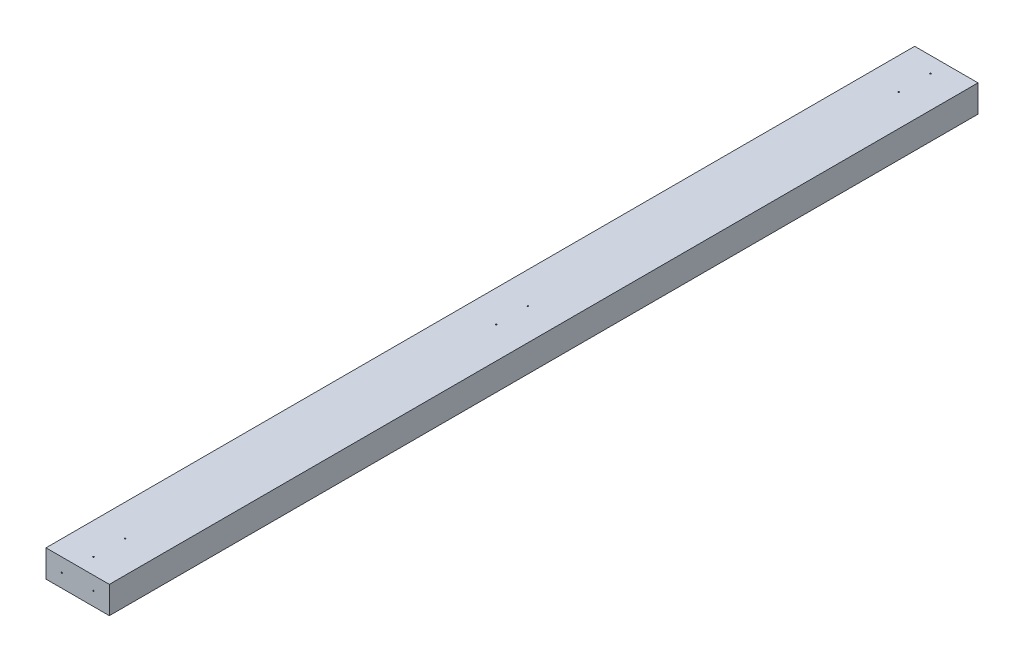
ISO-10303-21;
HEADER;
FILE_DESCRIPTION(('STEP AP214'),'2;1');
FILE_NAME('part.step','',(''),(''),'','','');
FILE_SCHEMA(('AUTOMOTIVE_DESIGN { 1 0 10303 214 1 1 1 1 }'));
ENDSEC;
DATA;
#1=APPLICATION_CONTEXT('core data for automotive mechanical design processes');
#2=APPLICATION_PROTOCOL_DEFINITION('international standard','automotive_design',2000,#1);
#3=PRODUCT_CONTEXT('',#1,'mechanical');
#4=PRODUCT('Part','Part','',(#3));
#5=PRODUCT_RELATED_PRODUCT_CATEGORY('part','',(#4));
#6=PRODUCT_DEFINITION_FORMATION('','',#4);
#7=PRODUCT_DEFINITION_CONTEXT('part definition',#1,'design');
#8=PRODUCT_DEFINITION('design','',#6,#7);
#9=PRODUCT_DEFINITION_SHAPE('','',#8);
#10=(LENGTH_UNIT() NAMED_UNIT(*) SI_UNIT(.MILLI.,.METRE.));
#11=(NAMED_UNIT(*) PLANE_ANGLE_UNIT() SI_UNIT($,.RADIAN.));
#12=(NAMED_UNIT(*) SI_UNIT($,.STERADIAN.) SOLID_ANGLE_UNIT());
#13=UNCERTAINTY_MEASURE_WITH_UNIT(LENGTH_MEASURE(1.E-05),#10,'distance_accuracy_value','');
#14=(GEOMETRIC_REPRESENTATION_CONTEXT(3) GLOBAL_UNCERTAINTY_ASSIGNED_CONTEXT((#13)) GLOBAL_UNIT_ASSIGNED_CONTEXT((#10,
#11,#12)) REPRESENTATION_CONTEXT('',''));
#15=CARTESIAN_POINT('',(0.,0.,0.));
#16=DIRECTION('',(0.,0.,1.));
#17=DIRECTION('',(1.,0.,0.));
#18=AXIS2_PLACEMENT_3D('',#15,#16,#17);
#19=CARTESIAN_POINT('',(0.,0.,1219.2));
#20=DIRECTION('',(1.,0.,0.));
#21=DIRECTION('',(0.,0.,-1.));
#22=AXIS2_PLACEMENT_3D('',#19,#20,#21);
#23=PLANE('',#22);
#24=DIRECTION('',(0.,-1.,0.));
#25=VECTOR('',#24,1.);
#26=CARTESIAN_POINT('',(0.,0.,0.));
#27=LINE('',#26,#25);
#28=CARTESIAN_POINT('',(0.,38.1,0.));
#29=VERTEX_POINT('',#28);
#30=CARTESIAN_POINT('',(0.,0.,0.));
#31=VERTEX_POINT('',#30);
#32=EDGE_CURVE('E95',#29,#31,#27,.T.);
#33=ORIENTED_EDGE('',*,*,#32,.T.);
#34=DIRECTION('',(0.,0.,-1.));
#35=VECTOR('',#34,1.);
#36=CARTESIAN_POINT('',(0.,0.,1219.2));
#37=LINE('',#36,#35);
#38=CARTESIAN_POINT('',(0.,0.,1219.2));
#39=VERTEX_POINT('',#38);
#40=EDGE_CURVE('E11',#39,#31,#37,.T.);
#41=ORIENTED_EDGE('',*,*,#40,.F.);
#42=DIRECTION('',(0.,-1.,0.));
#43=VECTOR('',#42,1.);
#44=CARTESIAN_POINT('',(0.,0.,1219.2));
#45=LINE('',#44,#43);
#46=CARTESIAN_POINT('',(0.,38.1,1219.2));
#47=VERTEX_POINT('',#46);
#48=EDGE_CURVE('E83',#47,#39,#45,.T.);
#49=ORIENTED_EDGE('',*,*,#48,.F.);
#50=DIRECTION('',(0.,0.,-1.));
#51=VECTOR('',#50,1.);
#52=CARTESIAN_POINT('',(0.,38.1,1219.2));
#53=LINE('',#52,#51);
#54=EDGE_CURVE('E91',#47,#29,#53,.T.);
#55=ORIENTED_EDGE('',*,*,#54,.T.);
#56=EDGE_LOOP('',(#33,#41,#49,#55));
#57=FACE_BOUND('',#56,.T.);
#58=ADVANCED_FACE('F32',(#57),#23,.F.);
#59=CARTESIAN_POINT('',(0.,0.,1219.2));
#60=DIRECTION('',(0.,1.,0.));
#61=DIRECTION('',(0.,0.,1.));
#62=AXIS2_PLACEMENT_3D('',#59,#60,#61);
#63=PLANE('',#62);
#64=CARTESIAN_POINT('',(44.4499999999982,0.,631.825000000001));
#65=DIRECTION('',(0.,-1.,0.));
#66=DIRECTION('',(0.,0.,-1.));
#67=AXIS2_PLACEMENT_3D('',#64,#65,#66);
#68=CIRCLE('',#67,0.876300000000114);
#69=CARTESIAN_POINT('',(44.4499999999982,0.,630.948700000001));
#70=VERTEX_POINT('',#69);
#71=EDGE_CURVE('E153',#70,#70,#68,.T.);
#72=ORIENTED_EDGE('',*,*,#71,.F.);
#73=EDGE_LOOP('',(#72));
#74=FACE_BOUND('',#73,.T.);
#75=CARTESIAN_POINT('',(44.4500000000001,0.,587.375000000002));
#76=DIRECTION('',(0.,-1.,0.));
#77=DIRECTION('',(0.,0.,-1.));
#78=AXIS2_PLACEMENT_3D('',#75,#76,#77);
#79=CIRCLE('',#78,0.876300000000121);
#80=CARTESIAN_POINT('',(44.4500000000001,0.,586.498700000001));
#81=VERTEX_POINT('',#80);
#82=EDGE_CURVE('E147',#81,#81,#79,.T.);
#83=ORIENTED_EDGE('',*,*,#82,.F.);
#84=EDGE_LOOP('',(#83));
#85=FACE_BOUND('',#84,.T.);
#86=CARTESIAN_POINT('',(44.45,0.,66.6750000000005));
#87=DIRECTION('',(0.,-1.,0.));
#88=DIRECTION('',(0.,0.,1.));
#89=AXIS2_PLACEMENT_3D('',#86,#87,#88);
#90=CIRCLE('',#89,0.876299999999982);
#91=CARTESIAN_POINT('',(44.45,0.,67.5513000000005));
#92=VERTEX_POINT('',#91);
#93=EDGE_CURVE('E141',#92,#92,#90,.T.);
#94=ORIENTED_EDGE('',*,*,#93,.F.);
#95=EDGE_LOOP('',(#94));
#96=FACE_BOUND('',#95,.T.);
#97=CARTESIAN_POINT('',(44.45,0.,22.2250000000004));
#98=DIRECTION('',(0.,-1.,0.));
#99=DIRECTION('',(0.,0.,1.));
#100=AXIS2_PLACEMENT_3D('',#97,#98,#99);
#101=CIRCLE('',#100,0.876299999999989);
#102=CARTESIAN_POINT('',(44.45,0.,23.1013000000004));
#103=VERTEX_POINT('',#102);
#104=EDGE_CURVE('E135',#103,#103,#101,.T.);
#105=ORIENTED_EDGE('',*,*,#104,.F.);
#106=EDGE_LOOP('',(#105));
#107=FACE_BOUND('',#106,.T.);
#108=CARTESIAN_POINT('',(44.45,0.,1152.525));
#109=DIRECTION('',(0.,-1.,0.));
#110=DIRECTION('',(0.,0.,-1.));
#111=AXIS2_PLACEMENT_3D('',#108,#109,#110);
#112=CIRCLE('',#111,0.876300000000082);
#113=CARTESIAN_POINT('',(44.45,0.,1151.6487));
#114=VERTEX_POINT('',#113);
#115=EDGE_CURVE('E129',#114,#114,#112,.T.);
#116=ORIENTED_EDGE('',*,*,#115,.F.);
#117=EDGE_LOOP('',(#116));
#118=FACE_BOUND('',#117,.T.);
#119=CARTESIAN_POINT('',(44.45,0.,1196.975));
#120=DIRECTION('',(0.,-1.,0.));
#121=DIRECTION('',(0.,0.,-1.));
#122=AXIS2_PLACEMENT_3D('',#119,#120,#121);
#123=CIRCLE('',#122,0.876300000000088);
#124=CARTESIAN_POINT('',(44.45,0.,1196.0987));
#125=VERTEX_POINT('',#124);
#126=EDGE_CURVE('E123',#125,#125,#123,.T.);
#127=ORIENTED_EDGE('',*,*,#126,.F.);
#128=EDGE_LOOP('',(#127));
#129=FACE_BOUND('',#128,.T.);
#130=DIRECTION('',(1.,0.,0.));
#131=VECTOR('',#130,1.);
#132=CARTESIAN_POINT('',(0.,0.,0.));
#133=LINE('',#132,#131);
#134=CARTESIAN_POINT('',(88.9,0.,0.));
#135=VERTEX_POINT('',#134);
#136=EDGE_CURVE('E87',#31,#135,#133,.T.);
#137=ORIENTED_EDGE('',*,*,#136,.T.);
#138=DIRECTION('',(0.,0.,-1.));
#139=VECTOR('',#138,1.);
#140=CARTESIAN_POINT('',(88.9,0.,1219.2));
#141=LINE('',#140,#139);
#142=CARTESIAN_POINT('',(88.9,0.,1219.2));
#143=VERTEX_POINT('',#142);
#144=EDGE_CURVE('E40',#143,#135,#141,.T.);
#145=ORIENTED_EDGE('',*,*,#144,.F.);
#146=DIRECTION('',(1.,0.,0.));
#147=VECTOR('',#146,1.);
#148=CARTESIAN_POINT('',(0.,0.,1219.2));
#149=LINE('',#148,#147);
#150=EDGE_CURVE('E78',#39,#143,#149,.T.);
#151=ORIENTED_EDGE('',*,*,#150,.F.);
#152=ORIENTED_EDGE('',*,*,#40,.T.);
#153=EDGE_LOOP('',(#137,#145,#151,#152));
#154=FACE_BOUND('',#153,.T.);
#155=ADVANCED_FACE('F86',(#74,#85,#96,#107,#118,#129,#154),#63,.F.);
#156=CARTESIAN_POINT('',(88.9,0.,1219.2));
#157=DIRECTION('',(-1.,0.,0.));
#158=DIRECTION('',(0.,0.,1.));
#159=AXIS2_PLACEMENT_3D('',#156,#157,#158);
#160=PLANE('',#159);
#161=DIRECTION('',(0.,1.,0.));
#162=VECTOR('',#161,1.);
#163=CARTESIAN_POINT('',(88.9,0.,0.));
#164=LINE('',#163,#162);
#165=CARTESIAN_POINT('',(88.9,38.1,0.));
#166=VERTEX_POINT('',#165);
#167=EDGE_CURVE('E65',#135,#166,#164,.T.);
#168=ORIENTED_EDGE('',*,*,#167,.T.);
#169=DIRECTION('',(0.,0.,-1.));
#170=VECTOR('',#169,1.);
#171=CARTESIAN_POINT('',(88.9,38.1,1219.2));
#172=LINE('',#171,#170);
#173=CARTESIAN_POINT('',(88.9,38.1,1219.2));
#174=VERTEX_POINT('',#173);
#175=EDGE_CURVE('E88',#174,#166,#172,.T.);
#176=ORIENTED_EDGE('',*,*,#175,.F.);
#177=DIRECTION('',(0.,1.,0.));
#178=VECTOR('',#177,1.);
#179=CARTESIAN_POINT('',(88.9,0.,1219.2));
#180=LINE('',#179,#178);
#181=EDGE_CURVE('E81',#143,#174,#180,.T.);
#182=ORIENTED_EDGE('',*,*,#181,.F.);
#183=ORIENTED_EDGE('',*,*,#144,.T.);
#184=EDGE_LOOP('',(#168,#176,#182,#183));
#185=FACE_BOUND('',#184,.T.);
#186=ADVANCED_FACE('F89',(#185),#160,.F.);
#187=CARTESIAN_POINT('',(0.,38.1,1219.2));
#188=DIRECTION('',(0.,-1.,0.));
#189=DIRECTION('',(0.,0.,-1.));
#190=AXIS2_PLACEMENT_3D('',#187,#188,#189);
#191=PLANE('',#190);
#192=CARTESIAN_POINT('',(44.4499999999982,38.1,631.825000000001));
#193=DIRECTION('',(0.,-1.,0.));
#194=DIRECTION('',(0.,0.,-1.));
#195=AXIS2_PLACEMENT_3D('',#192,#193,#194);
#196=CIRCLE('',#195,0.876300000000114);
#197=CARTESIAN_POINT('',(44.4499999999982,38.1,630.948700000001));
#198=VERTEX_POINT('',#197);
#199=EDGE_CURVE('E150',#198,#198,#196,.F.);
#200=ORIENTED_EDGE('',*,*,#199,.F.);
#201=EDGE_LOOP('',(#200));
#202=FACE_BOUND('',#201,.T.);
#203=CARTESIAN_POINT('',(44.4500000000001,38.1,587.375000000002));
#204=DIRECTION('',(0.,-1.,0.));
#205=DIRECTION('',(0.,0.,-1.));
#206=AXIS2_PLACEMENT_3D('',#203,#204,#205);
#207=CIRCLE('',#206,0.876300000000121);
#208=CARTESIAN_POINT('',(44.4500000000001,38.1,586.498700000001));
#209=VERTEX_POINT('',#208);
#210=EDGE_CURVE('E144',#209,#209,#207,.F.);
#211=ORIENTED_EDGE('',*,*,#210,.F.);
#212=EDGE_LOOP('',(#211));
#213=FACE_BOUND('',#212,.T.);
#214=CARTESIAN_POINT('',(44.45,38.1,66.6750000000005));
#215=DIRECTION('',(0.,-1.,0.));
#216=DIRECTION('',(0.,0.,-1.));
#217=AXIS2_PLACEMENT_3D('',#214,#215,#216);
#218=CIRCLE('',#217,0.876299999999982);
#219=CARTESIAN_POINT('',(44.45,38.1,65.7987000000005));
#220=VERTEX_POINT('',#219);
#221=EDGE_CURVE('E138',#220,#220,#218,.F.);
#222=ORIENTED_EDGE('',*,*,#221,.F.);
#223=EDGE_LOOP('',(#222));
#224=FACE_BOUND('',#223,.T.);
#225=CARTESIAN_POINT('',(44.45,38.1,22.2250000000004));
#226=DIRECTION('',(0.,-1.,0.));
#227=DIRECTION('',(0.,0.,-1.));
#228=AXIS2_PLACEMENT_3D('',#225,#226,#227);
#229=CIRCLE('',#228,0.876299999999989);
#230=CARTESIAN_POINT('',(44.45,38.1,21.3487000000004));
#231=VERTEX_POINT('',#230);
#232=EDGE_CURVE('E132',#231,#231,#229,.F.);
#233=ORIENTED_EDGE('',*,*,#232,.F.);
#234=EDGE_LOOP('',(#233));
#235=FACE_BOUND('',#234,.T.);
#236=CARTESIAN_POINT('',(44.45,38.1,1152.525));
#237=DIRECTION('',(0.,-1.,0.));
#238=DIRECTION('',(0.,0.,-1.));
#239=AXIS2_PLACEMENT_3D('',#236,#237,#238);
#240=CIRCLE('',#239,0.876300000000082);
#241=CARTESIAN_POINT('',(44.45,38.1,1151.6487));
#242=VERTEX_POINT('',#241);
#243=EDGE_CURVE('E126',#242,#242,#240,.F.);
#244=ORIENTED_EDGE('',*,*,#243,.F.);
#245=EDGE_LOOP('',(#244));
#246=FACE_BOUND('',#245,.T.);
#247=CARTESIAN_POINT('',(44.45,38.1,1196.975));
#248=DIRECTION('',(0.,-1.,0.));
#249=DIRECTION('',(0.,0.,-1.));
#250=AXIS2_PLACEMENT_3D('',#247,#248,#249);
#251=CIRCLE('',#250,0.876300000000088);
#252=CARTESIAN_POINT('',(44.45,38.1,1196.0987));
#253=VERTEX_POINT('',#252);
#254=EDGE_CURVE('E120',#253,#253,#251,.F.);
#255=ORIENTED_EDGE('',*,*,#254,.F.);
#256=EDGE_LOOP('',(#255));
#257=FACE_BOUND('',#256,.T.);
#258=DIRECTION('',(-1.,0.,0.));
#259=VECTOR('',#258,1.);
#260=CARTESIAN_POINT('',(0.,38.1,0.));
#261=LINE('',#260,#259);
#262=EDGE_CURVE('E71',#166,#29,#261,.T.);
#263=ORIENTED_EDGE('',*,*,#262,.T.);
#264=ORIENTED_EDGE('',*,*,#54,.F.);
#265=DIRECTION('',(-1.,0.,0.));
#266=VECTOR('',#265,1.);
#267=CARTESIAN_POINT('',(0.,38.1,1219.2));
#268=LINE('',#267,#266);
#269=EDGE_CURVE('E48',#174,#47,#268,.T.);
#270=ORIENTED_EDGE('',*,*,#269,.F.);
#271=ORIENTED_EDGE('',*,*,#175,.T.);
#272=EDGE_LOOP('',(#263,#264,#270,#271));
#273=FACE_BOUND('',#272,.T.);
#274=ADVANCED_FACE('F103',(#202,#213,#224,#235,#246,#257,#273),#191,.F.);
#275=CARTESIAN_POINT('',(0.,0.,1219.2));
#276=DIRECTION('',(0.,0.,-1.));
#277=DIRECTION('',(-1.,0.,0.));
#278=AXIS2_PLACEMENT_3D('',#275,#276,#277);
#279=PLANE('',#278);
#280=CARTESIAN_POINT('',(22.225,19.05,1219.2));
#281=DIRECTION('',(0.,0.,-1.));
#282=DIRECTION('',(-1.,0.,0.));
#283=AXIS2_PLACEMENT_3D('',#280,#281,#282);
#284=CIRCLE('',#283,0.876299999999999);
#285=CARTESIAN_POINT('',(21.3487,19.05,1219.2));
#286=VERTEX_POINT('',#285);
#287=EDGE_CURVE('E114',#286,#286,#284,.F.);
#288=ORIENTED_EDGE('',*,*,#287,.F.);
#289=EDGE_LOOP('',(#288));
#290=FACE_BOUND('',#289,.T.);
#291=CARTESIAN_POINT('',(66.675,19.05,1219.2));
#292=DIRECTION('',(0.,0.,-1.));
#293=DIRECTION('',(-1.,0.,0.));
#294=AXIS2_PLACEMENT_3D('',#291,#292,#293);
#295=CIRCLE('',#294,0.876300000000001);
#296=CARTESIAN_POINT('',(65.7987,19.05,1219.2));
#297=VERTEX_POINT('',#296);
#298=EDGE_CURVE('E98',#297,#297,#295,.F.);
#299=ORIENTED_EDGE('',*,*,#298,.F.);
#300=EDGE_LOOP('',(#299));
#301=FACE_BOUND('',#300,.T.);
#302=ORIENTED_EDGE('',*,*,#48,.T.);
#303=ORIENTED_EDGE('',*,*,#150,.T.);
#304=ORIENTED_EDGE('',*,*,#181,.T.);
#305=ORIENTED_EDGE('',*,*,#269,.T.);
#306=EDGE_LOOP('',(#302,#303,#304,#305));
#307=FACE_BOUND('',#306,.T.);
#308=ADVANCED_FACE('F79',(#290,#301,#307),#279,.F.);
#309=CARTESIAN_POINT('',(0.,0.,0.));
#310=DIRECTION('',(0.,0.,-1.));
#311=DIRECTION('',(-1.,0.,0.));
#312=AXIS2_PLACEMENT_3D('',#309,#310,#311);
#313=PLANE('',#312);
#314=CARTESIAN_POINT('',(22.225,19.05,0.));
#315=DIRECTION('',(0.,0.,-1.));
#316=DIRECTION('',(-1.,0.,0.));
#317=AXIS2_PLACEMENT_3D('',#314,#315,#316);
#318=CIRCLE('',#317,0.876299999999999);
#319=CARTESIAN_POINT('',(21.3487,19.05,0.));
#320=VERTEX_POINT('',#319);
#321=EDGE_CURVE('E117',#320,#320,#318,.T.);
#322=ORIENTED_EDGE('',*,*,#321,.F.);
#323=EDGE_LOOP('',(#322));
#324=FACE_BOUND('',#323,.T.);
#325=CARTESIAN_POINT('',(66.675,19.05,0.));
#326=DIRECTION('',(0.,0.,-1.));
#327=DIRECTION('',(-1.,0.,0.));
#328=AXIS2_PLACEMENT_3D('',#325,#326,#327);
#329=CIRCLE('',#328,0.876300000000001);
#330=CARTESIAN_POINT('',(65.7987,19.05,0.));
#331=VERTEX_POINT('',#330);
#332=EDGE_CURVE('E111',#331,#331,#329,.T.);
#333=ORIENTED_EDGE('',*,*,#332,.F.);
#334=EDGE_LOOP('',(#333));
#335=FACE_BOUND('',#334,.T.);
#336=ORIENTED_EDGE('',*,*,#32,.F.);
#337=ORIENTED_EDGE('',*,*,#262,.F.);
#338=ORIENTED_EDGE('',*,*,#167,.F.);
#339=ORIENTED_EDGE('',*,*,#136,.F.);
#340=EDGE_LOOP('',(#336,#337,#338,#339));
#341=FACE_BOUND('',#340,.T.);
#342=ADVANCED_FACE('F106',(#324,#335,#341),#313,.T.);
#343=CARTESIAN_POINT('',(66.675,19.05,1221.67855068942));
#344=DIRECTION('',(0.,0.,-1.));
#345=DIRECTION('',(-1.,0.,0.));
#346=AXIS2_PLACEMENT_3D('',#343,#344,#345);
#347=CYLINDRICAL_SURFACE('',#346,0.876300000000001);
#348=ORIENTED_EDGE('',*,*,#298,.T.);
#349=EDGE_LOOP('',(#348));
#350=FACE_BOUND('',#349,.T.);
#351=ORIENTED_EDGE('',*,*,#332,.T.);
#352=EDGE_LOOP('',(#351));
#353=FACE_BOUND('',#352,.T.);
#354=ADVANCED_FACE('F184',(#350,#353),#347,.F.);
#355=CARTESIAN_POINT('',(22.225,19.05,1221.67855068942));
#356=DIRECTION('',(0.,0.,-1.));
#357=DIRECTION('',(-1.,0.,0.));
#358=AXIS2_PLACEMENT_3D('',#355,#356,#357);
#359=CYLINDRICAL_SURFACE('',#358,0.876299999999999);
#360=ORIENTED_EDGE('',*,*,#287,.T.);
#361=EDGE_LOOP('',(#360));
#362=FACE_BOUND('',#361,.T.);
#363=ORIENTED_EDGE('',*,*,#321,.T.);
#364=EDGE_LOOP('',(#363));
#365=FACE_BOUND('',#364,.T.);
#366=ADVANCED_FACE('F174',(#362,#365),#359,.F.);
#367=CARTESIAN_POINT('',(44.45,40.5785506894155,1196.975));
#368=DIRECTION('',(0.,-1.,0.));
#369=DIRECTION('',(0.,0.,-1.));
#370=AXIS2_PLACEMENT_3D('',#367,#368,#369);
#371=CYLINDRICAL_SURFACE('',#370,0.876300000000088);
#372=ORIENTED_EDGE('',*,*,#254,.T.);
#373=EDGE_LOOP('',(#372));
#374=FACE_BOUND('',#373,.T.);
#375=ORIENTED_EDGE('',*,*,#126,.T.);
#376=EDGE_LOOP('',(#375));
#377=FACE_BOUND('',#376,.T.);
#378=ADVANCED_FACE('F171',(#374,#377),#371,.F.);
#379=CARTESIAN_POINT('',(44.45,40.5785506894155,1152.525));
#380=DIRECTION('',(0.,-1.,0.));
#381=DIRECTION('',(0.,0.,-1.));
#382=AXIS2_PLACEMENT_3D('',#379,#380,#381);
#383=CYLINDRICAL_SURFACE('',#382,0.876300000000082);
#384=ORIENTED_EDGE('',*,*,#243,.T.);
#385=EDGE_LOOP('',(#384));
#386=FACE_BOUND('',#385,.T.);
#387=ORIENTED_EDGE('',*,*,#115,.T.);
#388=EDGE_LOOP('',(#387));
#389=FACE_BOUND('',#388,.T.);
#390=ADVANCED_FACE('F173',(#386,#389),#383,.F.);
#391=CARTESIAN_POINT('',(44.45,40.5785506894155,22.2250000000004));
#392=DIRECTION('',(0.,-1.,0.));
#393=DIRECTION('',(0.,0.,-1.));
#394=AXIS2_PLACEMENT_3D('',#391,#392,#393);
#395=CYLINDRICAL_SURFACE('',#394,0.876299999999989);
#396=ORIENTED_EDGE('',*,*,#232,.T.);
#397=EDGE_LOOP('',(#396));
#398=FACE_BOUND('',#397,.T.);
#399=ORIENTED_EDGE('',*,*,#104,.T.);
#400=EDGE_LOOP('',(#399));
#401=FACE_BOUND('',#400,.T.);
#402=ADVANCED_FACE('F181',(#398,#401),#395,.F.);
#403=CARTESIAN_POINT('',(44.45,40.5785506894155,66.6750000000005));
#404=DIRECTION('',(0.,-1.,0.));
#405=DIRECTION('',(0.,0.,-1.));
#406=AXIS2_PLACEMENT_3D('',#403,#404,#405);
#407=CYLINDRICAL_SURFACE('',#406,0.876299999999982);
#408=ORIENTED_EDGE('',*,*,#221,.T.);
#409=EDGE_LOOP('',(#408));
#410=FACE_BOUND('',#409,.T.);
#411=ORIENTED_EDGE('',*,*,#93,.T.);
#412=EDGE_LOOP('',(#411));
#413=FACE_BOUND('',#412,.T.);
#414=ADVANCED_FACE('F253',(#410,#413),#407,.F.);
#415=CARTESIAN_POINT('',(44.4500000000001,40.5785506894155,587.375000000002));
#416=DIRECTION('',(0.,-1.,0.));
#417=DIRECTION('',(0.,0.,-1.));
#418=AXIS2_PLACEMENT_3D('',#415,#416,#417);
#419=CYLINDRICAL_SURFACE('',#418,0.876300000000121);
#420=ORIENTED_EDGE('',*,*,#210,.T.);
#421=EDGE_LOOP('',(#420));
#422=FACE_BOUND('',#421,.T.);
#423=ORIENTED_EDGE('',*,*,#82,.T.);
#424=EDGE_LOOP('',(#423));
#425=FACE_BOUND('',#424,.T.);
#426=ADVANCED_FACE('F262',(#422,#425),#419,.F.);
#427=CARTESIAN_POINT('',(44.4499999999982,40.5785506894155,631.825000000001));
#428=DIRECTION('',(0.,-1.,0.));
#429=DIRECTION('',(0.,0.,-1.));
#430=AXIS2_PLACEMENT_3D('',#427,#428,#429);
#431=CYLINDRICAL_SURFACE('',#430,0.876300000000114);
#432=ORIENTED_EDGE('',*,*,#199,.T.);
#433=EDGE_LOOP('',(#432));
#434=FACE_BOUND('',#433,.T.);
#435=ORIENTED_EDGE('',*,*,#71,.T.);
#436=EDGE_LOOP('',(#435));
#437=FACE_BOUND('',#436,.T.);
#438=ADVANCED_FACE('F157',(#434,#437),#431,.F.);
#439=CLOSED_SHELL('',(#58,#155,#186,#274,#308,#342,#354,#366,#378,#390,#402,#414,#426,#438));
#440=MANIFOLD_SOLID_BREP('B2',#439);
#441=ADVANCED_BREP_SHAPE_REPRESENTATION('',(#18,#440),#14);
#442=SHAPE_DEFINITION_REPRESENTATION(#9,#441);
ENDSEC;
END-ISO-10303-21;
